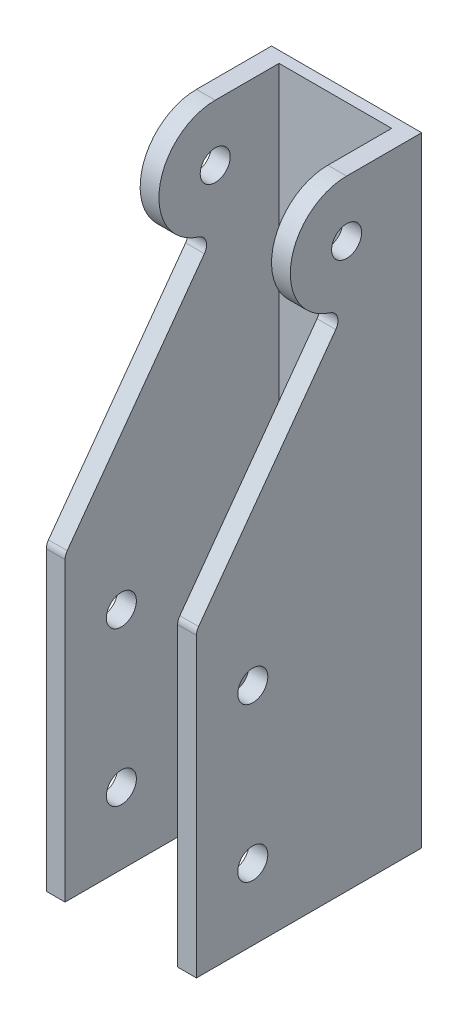
ISO-10303-21;
HEADER;
FILE_DESCRIPTION(('STEP AP214'),'2;1');
FILE_NAME('part.step','',(''),(''),'','','');
FILE_SCHEMA(('AUTOMOTIVE_DESIGN { 1 0 10303 214 1 1 1 1 }'));
ENDSEC;
DATA;
#1=APPLICATION_CONTEXT('core data for automotive mechanical design processes');
#2=APPLICATION_PROTOCOL_DEFINITION('international standard','automotive_design',2000,#1);
#3=PRODUCT_CONTEXT('',#1,'mechanical');
#4=PRODUCT('Part','Part','',(#3));
#5=PRODUCT_RELATED_PRODUCT_CATEGORY('part','',(#4));
#6=PRODUCT_DEFINITION_FORMATION('','',#4);
#7=PRODUCT_DEFINITION_CONTEXT('part definition',#1,'design');
#8=PRODUCT_DEFINITION('design','',#6,#7);
#9=PRODUCT_DEFINITION_SHAPE('','',#8);
#10=(LENGTH_UNIT() NAMED_UNIT(*) SI_UNIT(.MILLI.,.METRE.));
#11=(NAMED_UNIT(*) PLANE_ANGLE_UNIT() SI_UNIT($,.RADIAN.));
#12=(NAMED_UNIT(*) SI_UNIT($,.STERADIAN.) SOLID_ANGLE_UNIT());
#13=UNCERTAINTY_MEASURE_WITH_UNIT(LENGTH_MEASURE(1.E-05),#10,'distance_accuracy_value','');
#14=(GEOMETRIC_REPRESENTATION_CONTEXT(3) GLOBAL_UNCERTAINTY_ASSIGNED_CONTEXT((#13)) GLOBAL_UNIT_ASSIGNED_CONTEXT((#10,
#11,#12)) REPRESENTATION_CONTEXT('',''));
#15=CARTESIAN_POINT('',(0.,0.,0.));
#16=DIRECTION('',(0.,0.,1.));
#17=DIRECTION('',(1.,0.,0.));
#18=AXIS2_PLACEMENT_3D('',#15,#16,#17);
#19=CARTESIAN_POINT('',(20.,-100.,3.));
#20=DIRECTION('',(-1.,0.,0.));
#21=DIRECTION('',(0.,0.,1.));
#22=AXIS2_PLACEMENT_3D('',#19,#20,#21);
#23=PLANE('',#22);
#24=CARTESIAN_POINT('',(20.,-46.,45.));
#25=DIRECTION('',(-1.,0.,0.));
#26=DIRECTION('',(0.,0.,1.));
#27=AXIS2_PLACEMENT_3D('',#24,#25,#26);
#28=CIRCLE('',#27,4.);
#29=CARTESIAN_POINT('',(20.,-46.,49.));
#30=VERTEX_POINT('',#29);
#31=EDGE_CURVE('E312',#30,#30,#28,.T.);
#32=ORIENTED_EDGE('',*,*,#31,.T.);
#33=EDGE_LOOP('',(#32));
#34=FACE_BOUND('',#33,.T.);
#35=CARTESIAN_POINT('',(20.,-5.,45.));
#36=DIRECTION('',(-1.,0.,0.));
#37=DIRECTION('',(0.,0.,1.));
#38=AXIS2_PLACEMENT_3D('',#35,#36,#37);
#39=CIRCLE('',#38,4.);
#40=CARTESIAN_POINT('',(20.,-5.,49.));
#41=VERTEX_POINT('',#40);
#42=EDGE_CURVE('E305',#41,#41,#39,.T.);
#43=ORIENTED_EDGE('',*,*,#42,.T.);
#44=EDGE_LOOP('',(#43));
#45=FACE_BOUND('',#44,.T.);
#46=CARTESIAN_POINT('',(20.,85.,20.));
#47=DIRECTION('',(-1.,0.,0.));
#48=DIRECTION('',(0.,0.,1.));
#49=AXIS2_PLACEMENT_3D('',#46,#47,#48);
#50=CIRCLE('',#49,4.00000000000001);
#51=CARTESIAN_POINT('',(20.,85.,24.));
#52=VERTEX_POINT('',#51);
#53=EDGE_CURVE('E298',#52,#52,#50,.T.);
#54=ORIENTED_EDGE('',*,*,#53,.T.);
#55=EDGE_LOOP('',(#54));
#56=FACE_BOUND('',#55,.T.);
#57=DIRECTION('',(0.,-0.808736084303189,0.588171697675046));
#58=VECTOR('',#57,1.);
#59=CARTESIAN_POINT('',(20.,-33.1027027027027,94.9837837837838));
#60=LINE('',#59,#58);
#61=CARTESIAN_POINT('',(20.,66.0362138609409,22.8827535556794));
#62=VERTEX_POINT('',#61);
#63=CARTESIAN_POINT('',(20.,15.7889636522494,59.4262082529095));
#64=VERTEX_POINT('',#63);
#65=EDGE_CURVE('E273',#62,#64,#60,.T.);
#66=ORIENTED_EDGE('',*,*,#65,.T.);
#67=CARTESIAN_POINT('',(20.,14.0244485592242,57.));
#68=DIRECTION('',(-1.,0.,0.));
#69=DIRECTION('',(0.,0.,1.));
#70=AXIS2_PLACEMENT_3D('',#67,#68,#69);
#71=CIRCLE('',#70,3.);
#72=CARTESIAN_POINT('',(20.,14.0244485592242,60.));
#73=VERTEX_POINT('',#72);
#74=EDGE_CURVE('E364',#64,#73,#71,.F.);
#75=ORIENTED_EDGE('',*,*,#74,.T.);
#76=DIRECTION('',(0.,-1.,0.));
#77=VECTOR('',#76,1.);
#78=CARTESIAN_POINT('',(20.,-100.,60.));
#79=LINE('',#78,#77);
#80=CARTESIAN_POINT('',(20.,-65.,60.));
#81=VERTEX_POINT('',#80);
#82=EDGE_CURVE('E279',#73,#81,#79,.T.);
#83=ORIENTED_EDGE('',*,*,#82,.T.);
#84=DIRECTION('',(0.,0.,-1.));
#85=VECTOR('',#84,1.);
#86=CARTESIAN_POINT('',(20.,-65.,3.));
#87=LINE('',#86,#85);
#88=CARTESIAN_POINT('',(20.,-65.,0.));
#89=VERTEX_POINT('',#88);
#90=EDGE_CURVE('E286',#81,#89,#87,.T.);
#91=ORIENTED_EDGE('',*,*,#90,.T.);
#92=DIRECTION('',(0.,1.,0.));
#93=VECTOR('',#92,1.);
#94=CARTESIAN_POINT('',(20.,-100.,0.));
#95=LINE('',#94,#93);
#96=CARTESIAN_POINT('',(20.,100.,0.));
#97=VERTEX_POINT('',#96);
#98=EDGE_CURVE('E322',#89,#97,#95,.T.);
#99=ORIENTED_EDGE('',*,*,#98,.T.);
#100=DIRECTION('',(0.,0.,-1.));
#101=VECTOR('',#100,1.);
#102=CARTESIAN_POINT('',(20.,100.,3.));
#103=LINE('',#102,#101);
#104=CARTESIAN_POINT('',(20.,100.,20.));
#105=VERTEX_POINT('',#104);
#106=EDGE_CURVE('E337',#105,#97,#103,.T.);
#107=ORIENTED_EDGE('',*,*,#106,.F.);
#108=CARTESIAN_POINT('',(20.,85.,20.));
#109=DIRECTION('',(-1.,0.,0.));
#110=DIRECTION('',(0.,0.,1.));
#111=AXIS2_PLACEMENT_3D('',#108,#109,#110);
#112=CIRCLE('',#111,15.);
#113=CARTESIAN_POINT('',(20.,70.667274128305,24.4241348404908));
#114=VERTEX_POINT('',#113);
#115=EDGE_CURVE('E292',#114,#105,#112,.T.);
#116=ORIENTED_EDGE('',*,*,#115,.F.);
#117=CARTESIAN_POINT('',(20.,67.800728953966,25.308961808589));
#118=DIRECTION('',(-1.,0.,0.));
#119=DIRECTION('',(0.,0.,1.));
#120=AXIS2_PLACEMENT_3D('',#117,#118,#119);
#121=CIRCLE('',#120,3.);
#122=EDGE_CURVE('E378',#114,#62,#121,.T.);
#123=ORIENTED_EDGE('',*,*,#122,.T.);
#124=EDGE_LOOP('',(#66,#75,#83,#91,#99,#107,#116,#123));
#125=FACE_BOUND('',#124,.T.);
#126=ADVANCED_FACE('F120',(#34,#45,#56,#125),#23,.F.);
#127=CARTESIAN_POINT('',(-20.,100.,3.));
#128=DIRECTION('',(0.,-1.,0.));
#129=DIRECTION('',(0.,0.,-1.));
#130=AXIS2_PLACEMENT_3D('',#127,#128,#129);
#131=PLANE('',#130);
#132=DIRECTION('',(-1.,0.,0.));
#133=VECTOR('',#132,1.);
#134=CARTESIAN_POINT('',(40.,100.,20.));
#135=LINE('',#134,#133);
#136=CARTESIAN_POINT('',(15.,100.,20.));
#137=VERTEX_POINT('',#136);
#138=EDGE_CURVE('E267',#105,#137,#135,.T.);
#139=ORIENTED_EDGE('',*,*,#138,.F.);
#140=ORIENTED_EDGE('',*,*,#106,.T.);
#141=DIRECTION('',(-1.,0.,0.));
#142=VECTOR('',#141,1.);
#143=CARTESIAN_POINT('',(-20.,100.,0.));
#144=LINE('',#143,#142);
#145=CARTESIAN_POINT('',(-20.,100.,0.));
#146=VERTEX_POINT('',#145);
#147=EDGE_CURVE('E332',#97,#146,#144,.T.);
#148=ORIENTED_EDGE('',*,*,#147,.T.);
#149=DIRECTION('',(0.,0.,-1.));
#150=VECTOR('',#149,1.);
#151=CARTESIAN_POINT('',(-20.,100.,3.));
#152=LINE('',#151,#150);
#153=CARTESIAN_POINT('',(-20.,100.,20.));
#154=VERTEX_POINT('',#153);
#155=EDGE_CURVE('E329',#154,#146,#152,.T.);
#156=ORIENTED_EDGE('',*,*,#155,.F.);
#157=CARTESIAN_POINT('',(-15.,100.,20.));
#158=VERTEX_POINT('',#157);
#159=EDGE_CURVE('E264',#158,#154,#135,.T.);
#160=ORIENTED_EDGE('',*,*,#159,.F.);
#161=DIRECTION('',(0.,0.,-1.));
#162=VECTOR('',#161,1.);
#163=CARTESIAN_POINT('',(-15.,100.,63.));
#164=LINE('',#163,#162);
#165=CARTESIAN_POINT('',(-15.,100.,3.));
#166=VERTEX_POINT('',#165);
#167=EDGE_CURVE('E319',#158,#166,#164,.T.);
#168=ORIENTED_EDGE('',*,*,#167,.T.);
#169=DIRECTION('',(-1.,0.,0.));
#170=VECTOR('',#169,1.);
#171=CARTESIAN_POINT('',(-20.,100.,3.));
#172=LINE('',#171,#170);
#173=CARTESIAN_POINT('',(15.,100.,3.));
#174=VERTEX_POINT('',#173);
#175=EDGE_CURVE('E326',#174,#166,#172,.T.);
#176=ORIENTED_EDGE('',*,*,#175,.F.);
#177=DIRECTION('',(0.,0.,-1.));
#178=VECTOR('',#177,1.);
#179=CARTESIAN_POINT('',(15.,100.,63.));
#180=LINE('',#179,#178);
#181=EDGE_CURVE('E315',#137,#174,#180,.T.);
#182=ORIENTED_EDGE('',*,*,#181,.F.);
#183=EDGE_LOOP('',(#139,#140,#148,#156,#160,#168,#176,#182));
#184=FACE_BOUND('',#183,.T.);
#185=ADVANCED_FACE('F405',(#184),#131,.F.);
#186=CARTESIAN_POINT('',(-20.,-100.,3.));
#187=DIRECTION('',(1.,0.,0.));
#188=DIRECTION('',(0.,0.,-1.));
#189=AXIS2_PLACEMENT_3D('',#186,#187,#188);
#190=PLANE('',#189);
#191=CARTESIAN_POINT('',(-20.,-46.,45.));
#192=DIRECTION('',(-1.,0.,0.));
#193=DIRECTION('',(0.,0.,1.));
#194=AXIS2_PLACEMENT_3D('',#191,#192,#193);
#195=CIRCLE('',#194,4.);
#196=CARTESIAN_POINT('',(-20.,-46.,49.));
#197=VERTEX_POINT('',#196);
#198=EDGE_CURVE('E673',#197,#197,#195,.T.);
#199=ORIENTED_EDGE('',*,*,#198,.F.);
#200=EDGE_LOOP('',(#199));
#201=FACE_BOUND('',#200,.T.);
#202=CARTESIAN_POINT('',(-20.,-5.,45.));
#203=DIRECTION('',(-1.,0.,0.));
#204=DIRECTION('',(0.,0.,1.));
#205=AXIS2_PLACEMENT_3D('',#202,#203,#204);
#206=CIRCLE('',#205,4.);
#207=CARTESIAN_POINT('',(-20.,-5.,49.));
#208=VERTEX_POINT('',#207);
#209=EDGE_CURVE('E677',#208,#208,#206,.T.);
#210=ORIENTED_EDGE('',*,*,#209,.F.);
#211=EDGE_LOOP('',(#210));
#212=FACE_BOUND('',#211,.T.);
#213=CARTESIAN_POINT('',(-20.,85.,20.));
#214=DIRECTION('',(-1.,0.,0.));
#215=DIRECTION('',(0.,0.,1.));
#216=AXIS2_PLACEMENT_3D('',#213,#214,#215);
#217=CIRCLE('',#216,4.00000000000001);
#218=CARTESIAN_POINT('',(-20.,85.,24.));
#219=VERTEX_POINT('',#218);
#220=EDGE_CURVE('E386',#219,#219,#217,.T.);
#221=ORIENTED_EDGE('',*,*,#220,.F.);
#222=EDGE_LOOP('',(#221));
#223=FACE_BOUND('',#222,.T.);
#224=DIRECTION('',(0.,-1.,0.));
#225=VECTOR('',#224,1.);
#226=CARTESIAN_POINT('',(-20.,0.,60.));
#227=LINE('',#226,#225);
#228=CARTESIAN_POINT('',(-20.,14.0244485592242,60.));
#229=VERTEX_POINT('',#228);
#230=CARTESIAN_POINT('',(-20.,-65.,60.));
#231=VERTEX_POINT('',#230);
#232=EDGE_CURVE('E236',#229,#231,#227,.T.);
#233=ORIENTED_EDGE('',*,*,#232,.F.);
#234=CARTESIAN_POINT('',(-20.,14.0244485592242,57.));
#235=DIRECTION('',(1.,0.,0.));
#236=DIRECTION('',(0.,0.,-1.));
#237=AXIS2_PLACEMENT_3D('',#234,#235,#236);
#238=CIRCLE('',#237,3.);
#239=CARTESIAN_POINT('',(-20.,15.7889636522493,59.4262082529096));
#240=VERTEX_POINT('',#239);
#241=EDGE_CURVE('E367',#229,#240,#238,.F.);
#242=ORIENTED_EDGE('',*,*,#241,.T.);
#243=DIRECTION('',(0.,-0.808736084303189,0.588171697675046));
#244=VECTOR('',#243,1.);
#245=CARTESIAN_POINT('',(-20.,33.7297297297297,46.3783783783784));
#246=LINE('',#245,#244);
#247=CARTESIAN_POINT('',(-20.,66.0362138609409,22.8827535556794));
#248=VERTEX_POINT('',#247);
#249=EDGE_CURVE('E246',#248,#240,#246,.T.);
#250=ORIENTED_EDGE('',*,*,#249,.F.);
#251=CARTESIAN_POINT('',(-20.,67.800728953966,25.308961808589));
#252=DIRECTION('',(1.,0.,0.));
#253=DIRECTION('',(0.,0.,-1.));
#254=AXIS2_PLACEMENT_3D('',#251,#252,#253);
#255=CIRCLE('',#254,3.);
#256=CARTESIAN_POINT('',(-20.,70.667274128305,24.4241348404908));
#257=VERTEX_POINT('',#256);
#258=EDGE_CURVE('E128',#248,#257,#255,.T.);
#259=ORIENTED_EDGE('',*,*,#258,.T.);
#260=CARTESIAN_POINT('',(-20.,85.,20.));
#261=DIRECTION('',(-1.,0.,0.));
#262=DIRECTION('',(0.,0.,1.));
#263=AXIS2_PLACEMENT_3D('',#260,#261,#262);
#264=CIRCLE('',#263,15.);
#265=EDGE_CURVE('E380',#257,#154,#264,.T.);
#266=ORIENTED_EDGE('',*,*,#265,.T.);
#267=ORIENTED_EDGE('',*,*,#155,.T.);
#268=DIRECTION('',(0.,-1.,0.));
#269=VECTOR('',#268,1.);
#270=CARTESIAN_POINT('',(-20.,-100.,0.));
#271=LINE('',#270,#269);
#272=CARTESIAN_POINT('',(-20.,-65.,0.));
#273=VERTEX_POINT('',#272);
#274=EDGE_CURVE('E260',#146,#273,#271,.T.);
#275=ORIENTED_EDGE('',*,*,#274,.T.);
#276=DIRECTION('',(0.,0.,-1.));
#277=VECTOR('',#276,1.);
#278=CARTESIAN_POINT('',(-20.,-65.,0.));
#279=LINE('',#278,#277);
#280=EDGE_CURVE('E245',#231,#273,#279,.T.);
#281=ORIENTED_EDGE('',*,*,#280,.F.);
#282=EDGE_LOOP('',(#233,#242,#250,#259,#266,#267,#275,#281));
#283=FACE_BOUND('',#282,.T.);
#284=ADVANCED_FACE('F258',(#201,#212,#223,#283),#190,.F.);
#285=CARTESIAN_POINT('',(15.,100.,63.));
#286=DIRECTION('',(1.,0.,0.));
#287=DIRECTION('',(0.,1.,0.));
#288=AXIS2_PLACEMENT_3D('',#285,#286,#287);
#289=PLANE('',#288);
#290=CARTESIAN_POINT('',(15.,-46.,45.));
#291=DIRECTION('',(1.,0.,0.));
#292=DIRECTION('',(0.,1.,0.));
#293=AXIS2_PLACEMENT_3D('',#290,#291,#292);
#294=CIRCLE('',#293,4.);
#295=CARTESIAN_POINT('',(15.,-42.,45.));
#296=VERTEX_POINT('',#295);
#297=EDGE_CURVE('E309',#296,#296,#294,.T.);
#298=ORIENTED_EDGE('',*,*,#297,.T.);
#299=EDGE_LOOP('',(#298));
#300=FACE_BOUND('',#299,.T.);
#301=CARTESIAN_POINT('',(15.,-5.,45.));
#302=DIRECTION('',(1.,0.,0.));
#303=DIRECTION('',(0.,1.,0.));
#304=AXIS2_PLACEMENT_3D('',#301,#302,#303);
#305=CIRCLE('',#304,4.);
#306=CARTESIAN_POINT('',(15.,-0.999999999999999,45.));
#307=VERTEX_POINT('',#306);
#308=EDGE_CURVE('E302',#307,#307,#305,.T.);
#309=ORIENTED_EDGE('',*,*,#308,.T.);
#310=EDGE_LOOP('',(#309));
#311=FACE_BOUND('',#310,.T.);
#312=CARTESIAN_POINT('',(15.,85.,20.));
#313=DIRECTION('',(1.,0.,0.));
#314=DIRECTION('',(0.,1.,0.));
#315=AXIS2_PLACEMENT_3D('',#312,#313,#314);
#316=CIRCLE('',#315,4.00000000000001);
#317=CARTESIAN_POINT('',(15.,89.,20.));
#318=VERTEX_POINT('',#317);
#319=EDGE_CURVE('E295',#318,#318,#316,.T.);
#320=ORIENTED_EDGE('',*,*,#319,.T.);
#321=EDGE_LOOP('',(#320));
#322=FACE_BOUND('',#321,.T.);
#323=DIRECTION('',(0.,1.,0.));
#324=VECTOR('',#323,1.);
#325=CARTESIAN_POINT('',(15.,100.,60.));
#326=LINE('',#325,#324);
#327=CARTESIAN_POINT('',(15.,-65.,60.));
#328=VERTEX_POINT('',#327);
#329=CARTESIAN_POINT('',(15.,14.0244485592242,60.));
#330=VERTEX_POINT('',#329);
#331=EDGE_CURVE('E276',#328,#330,#326,.T.);
#332=ORIENTED_EDGE('',*,*,#331,.T.);
#333=CARTESIAN_POINT('',(15.,14.0244485592242,57.));
#334=DIRECTION('',(1.,0.,0.));
#335=DIRECTION('',(0.,1.,0.));
#336=AXIS2_PLACEMENT_3D('',#333,#334,#335);
#337=CIRCLE('',#336,3.);
#338=CARTESIAN_POINT('',(15.,15.7889636522493,59.4262082529096));
#339=VERTEX_POINT('',#338);
#340=EDGE_CURVE('E362',#330,#339,#337,.F.);
#341=ORIENTED_EDGE('',*,*,#340,.T.);
#342=DIRECTION('',(0.,0.808736084303189,-0.588171697675046));
#343=VECTOR('',#342,1.);
#344=CARTESIAN_POINT('',(15.,69.1675675675676,20.6054054054054));
#345=LINE('',#344,#343);
#346=CARTESIAN_POINT('',(15.,66.0362138609409,22.8827535556794));
#347=VERTEX_POINT('',#346);
#348=EDGE_CURVE('E270',#339,#347,#345,.T.);
#349=ORIENTED_EDGE('',*,*,#348,.T.);
#350=CARTESIAN_POINT('',(15.,67.800728953966,25.308961808589));
#351=DIRECTION('',(1.,0.,0.));
#352=DIRECTION('',(0.,1.,0.));
#353=AXIS2_PLACEMENT_3D('',#350,#351,#352);
#354=CIRCLE('',#353,3.);
#355=CARTESIAN_POINT('',(15.,70.667274128305,24.4241348404908));
#356=VERTEX_POINT('',#355);
#357=EDGE_CURVE('E376',#347,#356,#354,.T.);
#358=ORIENTED_EDGE('',*,*,#357,.T.);
#359=CARTESIAN_POINT('',(15.,85.,20.));
#360=DIRECTION('',(1.,0.,0.));
#361=DIRECTION('',(0.,1.,0.));
#362=AXIS2_PLACEMENT_3D('',#359,#360,#361);
#363=CIRCLE('',#362,15.);
#364=EDGE_CURVE('E289',#137,#356,#363,.T.);
#365=ORIENTED_EDGE('',*,*,#364,.F.);
#366=ORIENTED_EDGE('',*,*,#181,.T.);
#367=DIRECTION('',(0.,-1.,0.));
#368=VECTOR('',#367,1.);
#369=CARTESIAN_POINT('',(15.,100.,3.));
#370=LINE('',#369,#368);
#371=CARTESIAN_POINT('',(15.,-65.,3.));
#372=VERTEX_POINT('',#371);
#373=EDGE_CURVE('E320',#174,#372,#370,.T.);
#374=ORIENTED_EDGE('',*,*,#373,.T.);
#375=DIRECTION('',(0.,0.,1.));
#376=VECTOR('',#375,1.);
#377=CARTESIAN_POINT('',(15.,-65.,63.));
#378=LINE('',#377,#376);
#379=EDGE_CURVE('E283',#372,#328,#378,.T.);
#380=ORIENTED_EDGE('',*,*,#379,.T.);
#381=EDGE_LOOP('',(#332,#341,#349,#358,#365,#366,#374,#380));
#382=FACE_BOUND('',#381,.T.);
#383=ADVANCED_FACE('F424',(#300,#311,#322,#382),#289,.F.);
#384=CARTESIAN_POINT('',(-15.,100.,63.));
#385=DIRECTION('',(-1.,0.,0.));
#386=DIRECTION('',(0.,-1.,0.));
#387=AXIS2_PLACEMENT_3D('',#384,#385,#386);
#388=PLANE('',#387);
#389=CARTESIAN_POINT('',(-15.,-46.,45.));
#390=DIRECTION('',(-1.,0.,0.));
#391=DIRECTION('',(0.,-1.,0.));
#392=AXIS2_PLACEMENT_3D('',#389,#390,#391);
#393=CIRCLE('',#392,4.);
#394=CARTESIAN_POINT('',(-15.,-50.,45.));
#395=VERTEX_POINT('',#394);
#396=EDGE_CURVE('E308',#395,#395,#393,.T.);
#397=ORIENTED_EDGE('',*,*,#396,.T.);
#398=EDGE_LOOP('',(#397));
#399=FACE_BOUND('',#398,.T.);
#400=CARTESIAN_POINT('',(-15.,-5.,45.));
#401=DIRECTION('',(-1.,0.,0.));
#402=DIRECTION('',(0.,-1.,0.));
#403=AXIS2_PLACEMENT_3D('',#400,#401,#402);
#404=CIRCLE('',#403,4.);
#405=CARTESIAN_POINT('',(-15.,-9.,45.));
#406=VERTEX_POINT('',#405);
#407=EDGE_CURVE('E301',#406,#406,#404,.T.);
#408=ORIENTED_EDGE('',*,*,#407,.T.);
#409=EDGE_LOOP('',(#408));
#410=FACE_BOUND('',#409,.T.);
#411=CARTESIAN_POINT('',(-15.,85.,20.));
#412=DIRECTION('',(-1.,0.,0.));
#413=DIRECTION('',(0.,-1.,0.));
#414=AXIS2_PLACEMENT_3D('',#411,#412,#413);
#415=CIRCLE('',#414,4.00000000000001);
#416=CARTESIAN_POINT('',(-15.,81.,20.));
#417=VERTEX_POINT('',#416);
#418=EDGE_CURVE('E294',#417,#417,#415,.T.);
#419=ORIENTED_EDGE('',*,*,#418,.T.);
#420=EDGE_LOOP('',(#419));
#421=FACE_BOUND('',#420,.T.);
#422=DIRECTION('',(0.,-0.808736084303189,0.588171697675046));
#423=VECTOR('',#422,1.);
#424=CARTESIAN_POINT('',(-15.,69.1675675675676,20.6054054054054));
#425=LINE('',#424,#423);
#426=CARTESIAN_POINT('',(-15.,66.0362138609409,22.8827535556794));
#427=VERTEX_POINT('',#426);
#428=CARTESIAN_POINT('',(-15.,15.7889636522493,59.4262082529096));
#429=VERTEX_POINT('',#428);
#430=EDGE_CURVE('E339',#427,#429,#425,.T.);
#431=ORIENTED_EDGE('',*,*,#430,.T.);
#432=CARTESIAN_POINT('',(-15.,14.0244485592242,57.));
#433=DIRECTION('',(-1.,0.,0.));
#434=DIRECTION('',(0.,-1.,0.));
#435=AXIS2_PLACEMENT_3D('',#432,#433,#434);
#436=CIRCLE('',#435,3.);
#437=CARTESIAN_POINT('',(-15.,14.0244485592242,60.));
#438=VERTEX_POINT('',#437);
#439=EDGE_CURVE('E373',#429,#438,#436,.F.);
#440=ORIENTED_EDGE('',*,*,#439,.T.);
#441=DIRECTION('',(0.,-1.,0.));
#442=VECTOR('',#441,1.);
#443=CARTESIAN_POINT('',(-15.,100.,60.));
#444=LINE('',#443,#442);
#445=CARTESIAN_POINT('',(-15.,-65.,60.));
#446=VERTEX_POINT('',#445);
#447=EDGE_CURVE('E341',#438,#446,#444,.T.);
#448=ORIENTED_EDGE('',*,*,#447,.T.);
#449=DIRECTION('',(0.,0.,-1.));
#450=VECTOR('',#449,1.);
#451=CARTESIAN_POINT('',(-15.,-65.,63.));
#452=LINE('',#451,#450);
#453=CARTESIAN_POINT('',(-15.,-65.,3.));
#454=VERTEX_POINT('',#453);
#455=EDGE_CURVE('E254',#446,#454,#452,.T.);
#456=ORIENTED_EDGE('',*,*,#455,.T.);
#457=DIRECTION('',(0.,1.,0.));
#458=VECTOR('',#457,1.);
#459=CARTESIAN_POINT('',(-15.,100.,3.));
#460=LINE('',#459,#458);
#461=EDGE_CURVE('E316',#454,#166,#460,.T.);
#462=ORIENTED_EDGE('',*,*,#461,.T.);
#463=ORIENTED_EDGE('',*,*,#167,.F.);
#464=CARTESIAN_POINT('',(-15.,85.,20.));
#465=DIRECTION('',(-1.,0.,0.));
#466=DIRECTION('',(0.,-1.,0.));
#467=AXIS2_PLACEMENT_3D('',#464,#465,#466);
#468=CIRCLE('',#467,15.);
#469=CARTESIAN_POINT('',(-15.,70.667274128305,24.4241348404908));
#470=VERTEX_POINT('',#469);
#471=EDGE_CURVE('E344',#470,#158,#468,.T.);
#472=ORIENTED_EDGE('',*,*,#471,.F.);
#473=CARTESIAN_POINT('',(-15.,67.800728953966,25.308961808589));
#474=DIRECTION('',(-1.,0.,0.));
#475=DIRECTION('',(0.,-1.,0.));
#476=AXIS2_PLACEMENT_3D('',#473,#474,#475);
#477=CIRCLE('',#476,3.);
#478=EDGE_CURVE('E12',#470,#427,#477,.T.);
#479=ORIENTED_EDGE('',*,*,#478,.T.);
#480=EDGE_LOOP('',(#431,#440,#448,#456,#462,#463,#472,#479));
#481=FACE_BOUND('',#480,.T.);
#482=ADVANCED_FACE('F390',(#399,#410,#421,#481),#388,.F.);
#483=CARTESIAN_POINT('',(0.,0.,3.));
#484=DIRECTION('',(0.,0.,1.));
#485=DIRECTION('',(1.,0.,0.));
#486=AXIS2_PLACEMENT_3D('',#483,#484,#485);
#487=PLANE('',#486);
#488=DIRECTION('',(-1.,0.,0.));
#489=VECTOR('',#488,1.);
#490=CARTESIAN_POINT('',(0.,-65.,3.));
#491=LINE('',#490,#489);
#492=EDGE_CURVE('E281',#372,#454,#491,.T.);
#493=ORIENTED_EDGE('',*,*,#492,.F.);
#494=ORIENTED_EDGE('',*,*,#373,.F.);
#495=ORIENTED_EDGE('',*,*,#175,.T.);
#496=ORIENTED_EDGE('',*,*,#461,.F.);
#497=EDGE_LOOP('',(#493,#494,#495,#496));
#498=FACE_BOUND('',#497,.T.);
#499=ADVANCED_FACE('F399',(#498),#487,.T.);
#500=CARTESIAN_POINT('',(0.,0.,0.));
#501=DIRECTION('',(0.,0.,1.));
#502=DIRECTION('',(1.,0.,0.));
#503=AXIS2_PLACEMENT_3D('',#500,#501,#502);
#504=PLANE('',#503);
#505=ORIENTED_EDGE('',*,*,#98,.F.);
#506=DIRECTION('',(-1.,0.,0.));
#507=VECTOR('',#506,1.);
#508=CARTESIAN_POINT('',(40.,-65.,0.));
#509=LINE('',#508,#507);
#510=EDGE_CURVE('E268',#89,#273,#509,.T.);
#511=ORIENTED_EDGE('',*,*,#510,.T.);
#512=ORIENTED_EDGE('',*,*,#274,.F.);
#513=ORIENTED_EDGE('',*,*,#147,.F.);
#514=EDGE_LOOP('',(#505,#511,#512,#513));
#515=FACE_BOUND('',#514,.T.);
#516=ADVANCED_FACE('F410',(#515),#504,.F.);
#517=CARTESIAN_POINT('',(40.,85.,20.));
#518=DIRECTION('',(-1.,0.,0.));
#519=DIRECTION('',(0.,0.,1.));
#520=AXIS2_PLACEMENT_3D('',#517,#518,#519);
#521=CYLINDRICAL_SURFACE('',#520,15.);
#522=ORIENTED_EDGE('',*,*,#364,.T.);
#523=DIRECTION('',(-1.,0.,0.));
#524=VECTOR('',#523,1.);
#525=CARTESIAN_POINT('',(40.,70.667274128305,24.4241348404908));
#526=LINE('',#525,#524);
#527=EDGE_CURVE('E357',#356,#114,#526,.F.);
#528=ORIENTED_EDGE('',*,*,#527,.T.);
#529=ORIENTED_EDGE('',*,*,#115,.T.);
#530=ORIENTED_EDGE('',*,*,#138,.T.);
#531=EDGE_LOOP('',(#522,#528,#529,#530));
#532=FACE_BOUND('',#531,.T.);
#533=ADVANCED_FACE('F435',(#532),#521,.T.);
#534=ORIENTED_EDGE('',*,*,#265,.F.);
#535=DIRECTION('',(-1.,0.,0.));
#536=VECTOR('',#535,1.);
#537=CARTESIAN_POINT('',(40.,70.667274128305,24.4241348404908));
#538=LINE('',#537,#536);
#539=EDGE_CURVE('E135',#257,#470,#538,.F.);
#540=ORIENTED_EDGE('',*,*,#539,.T.);
#541=ORIENTED_EDGE('',*,*,#471,.T.);
#542=ORIENTED_EDGE('',*,*,#159,.T.);
#543=EDGE_LOOP('',(#534,#540,#541,#542));
#544=FACE_BOUND('',#543,.T.);
#545=ADVANCED_FACE('F383',(#544),#521,.T.);
#546=CARTESIAN_POINT('',(40.,-65.,0.));
#547=DIRECTION('',(0.,1.,0.));
#548=DIRECTION('',(0.,0.,1.));
#549=AXIS2_PLACEMENT_3D('',#546,#547,#548);
#550=PLANE('',#549);
#551=DIRECTION('',(-1.,0.,0.));
#552=VECTOR('',#551,1.);
#553=CARTESIAN_POINT('',(40.,-65.,60.));
#554=LINE('',#553,#552);
#555=EDGE_CURVE('E255',#81,#328,#554,.T.);
#556=ORIENTED_EDGE('',*,*,#555,.T.);
#557=ORIENTED_EDGE('',*,*,#379,.F.);
#558=ORIENTED_EDGE('',*,*,#492,.T.);
#559=ORIENTED_EDGE('',*,*,#455,.F.);
#560=EDGE_CURVE('E240',#446,#231,#554,.T.);
#561=ORIENTED_EDGE('',*,*,#560,.T.);
#562=ORIENTED_EDGE('',*,*,#280,.T.);
#563=ORIENTED_EDGE('',*,*,#510,.F.);
#564=ORIENTED_EDGE('',*,*,#90,.F.);
#565=EDGE_LOOP('',(#556,#557,#558,#559,#561,#562,#563,#564));
#566=FACE_BOUND('',#565,.T.);
#567=ADVANCED_FACE('F251',(#566),#550,.F.);
#568=CARTESIAN_POINT('',(40.,0.,60.));
#569=DIRECTION('',(0.,0.,-1.));
#570=DIRECTION('',(-1.,0.,0.));
#571=AXIS2_PLACEMENT_3D('',#568,#569,#570);
#572=PLANE('',#571);
#573=ORIENTED_EDGE('',*,*,#82,.F.);
#574=DIRECTION('',(-1.,0.,0.));
#575=VECTOR('',#574,1.);
#576=CARTESIAN_POINT('',(40.,14.0244485592242,60.));
#577=LINE('',#576,#575);
#578=EDGE_CURVE('E359',#73,#330,#577,.T.);
#579=ORIENTED_EDGE('',*,*,#578,.T.);
#580=ORIENTED_EDGE('',*,*,#331,.F.);
#581=ORIENTED_EDGE('',*,*,#555,.F.);
#582=EDGE_LOOP('',(#573,#579,#580,#581));
#583=FACE_BOUND('',#582,.T.);
#584=ADVANCED_FACE('F418',(#583),#572,.F.);
#585=ORIENTED_EDGE('',*,*,#447,.F.);
#586=DIRECTION('',(-1.,0.,0.));
#587=VECTOR('',#586,1.);
#588=CARTESIAN_POINT('',(40.,14.0244485592242,60.));
#589=LINE('',#588,#587);
#590=EDGE_CURVE('E242',#438,#229,#589,.T.);
#591=ORIENTED_EDGE('',*,*,#590,.T.);
#592=ORIENTED_EDGE('',*,*,#232,.T.);
#593=ORIENTED_EDGE('',*,*,#560,.F.);
#594=EDGE_LOOP('',(#585,#591,#592,#593));
#595=FACE_BOUND('',#594,.T.);
#596=ADVANCED_FACE('F239',(#595),#572,.F.);
#597=CARTESIAN_POINT('',(40.,33.7297297297297,46.3783783783784));
#598=DIRECTION('',(0.,-0.588171697675046,-0.808736084303189));
#599=DIRECTION('',(0.,0.808736084303189,-0.588171697675046));
#600=AXIS2_PLACEMENT_3D('',#597,#598,#599);
#601=PLANE('',#600);
#602=ORIENTED_EDGE('',*,*,#65,.F.);
#603=DIRECTION('',(-1.,0.,0.));
#604=VECTOR('',#603,1.);
#605=CARTESIAN_POINT('',(40.,66.0362138609409,22.8827535556794));
#606=LINE('',#605,#604);
#607=EDGE_CURVE('E354',#62,#347,#606,.T.);
#608=ORIENTED_EDGE('',*,*,#607,.T.);
#609=ORIENTED_EDGE('',*,*,#348,.F.);
#610=DIRECTION('',(-1.,0.,0.));
#611=VECTOR('',#610,1.);
#612=CARTESIAN_POINT('',(40.,15.7889636522493,59.4262082529096));
#613=LINE('',#612,#611);
#614=EDGE_CURVE('E346',#339,#64,#613,.F.);
#615=ORIENTED_EDGE('',*,*,#614,.T.);
#616=EDGE_LOOP('',(#602,#608,#609,#615));
#617=FACE_BOUND('',#616,.T.);
#618=ADVANCED_FACE('F427',(#617),#601,.F.);
#619=ORIENTED_EDGE('',*,*,#249,.T.);
#620=DIRECTION('',(-1.,0.,0.));
#621=VECTOR('',#620,1.);
#622=CARTESIAN_POINT('',(40.,15.7889636522493,59.4262082529096));
#623=LINE('',#622,#621);
#624=EDGE_CURVE('E143',#240,#429,#623,.F.);
#625=ORIENTED_EDGE('',*,*,#624,.T.);
#626=ORIENTED_EDGE('',*,*,#430,.F.);
#627=DIRECTION('',(-1.,0.,0.));
#628=VECTOR('',#627,1.);
#629=CARTESIAN_POINT('',(40.,66.0362138609409,22.8827535556794));
#630=LINE('',#629,#628);
#631=EDGE_CURVE('E369',#427,#248,#630,.T.);
#632=ORIENTED_EDGE('',*,*,#631,.T.);
#633=EDGE_LOOP('',(#619,#625,#626,#632));
#634=FACE_BOUND('',#633,.T.);
#635=ADVANCED_FACE('F393',(#634),#601,.F.);
#636=CARTESIAN_POINT('',(40.,85.,20.));
#637=DIRECTION('',(-1.,0.,0.));
#638=DIRECTION('',(0.,0.,1.));
#639=AXIS2_PLACEMENT_3D('',#636,#637,#638);
#640=CYLINDRICAL_SURFACE('',#639,4.00000000000001);
#641=ORIENTED_EDGE('',*,*,#220,.T.);
#642=EDGE_LOOP('',(#641));
#643=FACE_BOUND('',#642,.T.);
#644=ORIENTED_EDGE('',*,*,#418,.F.);
#645=EDGE_LOOP('',(#644));
#646=FACE_BOUND('',#645,.T.);
#647=ADVANCED_FACE('F519',(#643,#646),#640,.F.);
#648=CARTESIAN_POINT('',(40.,-5.,45.));
#649=DIRECTION('',(-1.,0.,0.));
#650=DIRECTION('',(0.,0.,1.));
#651=AXIS2_PLACEMENT_3D('',#648,#649,#650);
#652=CYLINDRICAL_SURFACE('',#651,4.);
#653=ORIENTED_EDGE('',*,*,#209,.T.);
#654=EDGE_LOOP('',(#653));
#655=FACE_BOUND('',#654,.T.);
#656=ORIENTED_EDGE('',*,*,#407,.F.);
#657=EDGE_LOOP('',(#656));
#658=FACE_BOUND('',#657,.T.);
#659=ADVANCED_FACE('F509',(#655,#658),#652,.F.);
#660=CARTESIAN_POINT('',(40.,-46.,45.));
#661=DIRECTION('',(-1.,0.,0.));
#662=DIRECTION('',(0.,0.,1.));
#663=AXIS2_PLACEMENT_3D('',#660,#661,#662);
#664=CYLINDRICAL_SURFACE('',#663,4.);
#665=ORIENTED_EDGE('',*,*,#198,.T.);
#666=EDGE_LOOP('',(#665));
#667=FACE_BOUND('',#666,.T.);
#668=ORIENTED_EDGE('',*,*,#396,.F.);
#669=EDGE_LOOP('',(#668));
#670=FACE_BOUND('',#669,.T.);
#671=ADVANCED_FACE('F498',(#667,#670),#664,.F.);
#672=ORIENTED_EDGE('',*,*,#319,.F.);
#673=EDGE_LOOP('',(#672));
#674=FACE_BOUND('',#673,.T.);
#675=ORIENTED_EDGE('',*,*,#53,.F.);
#676=EDGE_LOOP('',(#675));
#677=FACE_BOUND('',#676,.T.);
#678=ADVANCED_FACE('F506',(#674,#677),#640,.F.);
#679=ORIENTED_EDGE('',*,*,#308,.F.);
#680=EDGE_LOOP('',(#679));
#681=FACE_BOUND('',#680,.T.);
#682=ORIENTED_EDGE('',*,*,#42,.F.);
#683=EDGE_LOOP('',(#682));
#684=FACE_BOUND('',#683,.T.);
#685=ADVANCED_FACE('F495',(#681,#684),#652,.F.);
#686=ORIENTED_EDGE('',*,*,#297,.F.);
#687=EDGE_LOOP('',(#686));
#688=FACE_BOUND('',#687,.T.);
#689=ORIENTED_EDGE('',*,*,#31,.F.);
#690=EDGE_LOOP('',(#689));
#691=FACE_BOUND('',#690,.T.);
#692=ADVANCED_FACE('F461',(#688,#691),#664,.F.);
#693=CARTESIAN_POINT('',(40.,67.800728953966,25.308961808589));
#694=DIRECTION('',(-1.,0.,0.));
#695=DIRECTION('',(0.,0.,1.));
#696=AXIS2_PLACEMENT_3D('',#693,#694,#695);
#697=CYLINDRICAL_SURFACE('',#696,3.);
#698=ORIENTED_EDGE('',*,*,#122,.F.);
#699=ORIENTED_EDGE('',*,*,#527,.F.);
#700=ORIENTED_EDGE('',*,*,#357,.F.);
#701=ORIENTED_EDGE('',*,*,#607,.F.);
#702=EDGE_LOOP('',(#698,#699,#700,#701));
#703=FACE_BOUND('',#702,.T.);
#704=ADVANCED_FACE('F431',(#703),#697,.F.);
#705=CARTESIAN_POINT('',(40.,14.0244485592242,57.));
#706=DIRECTION('',(-1.,0.,0.));
#707=DIRECTION('',(0.,0.,1.));
#708=AXIS2_PLACEMENT_3D('',#705,#706,#707);
#709=CYLINDRICAL_SURFACE('',#708,3.);
#710=ORIENTED_EDGE('',*,*,#74,.F.);
#711=ORIENTED_EDGE('',*,*,#614,.F.);
#712=ORIENTED_EDGE('',*,*,#340,.F.);
#713=ORIENTED_EDGE('',*,*,#578,.F.);
#714=EDGE_LOOP('',(#710,#711,#712,#713));
#715=FACE_BOUND('',#714,.T.);
#716=ADVANCED_FACE('F420',(#715),#709,.T.);
#717=CARTESIAN_POINT('',(40.,14.0244485592242,57.));
#718=DIRECTION('',(-1.,0.,0.));
#719=DIRECTION('',(0.,0.,1.));
#720=AXIS2_PLACEMENT_3D('',#717,#718,#719);
#721=CYLINDRICAL_SURFACE('',#720,3.);
#722=ORIENTED_EDGE('',*,*,#439,.F.);
#723=ORIENTED_EDGE('',*,*,#624,.F.);
#724=ORIENTED_EDGE('',*,*,#241,.F.);
#725=ORIENTED_EDGE('',*,*,#590,.F.);
#726=EDGE_LOOP('',(#722,#723,#724,#725));
#727=FACE_BOUND('',#726,.T.);
#728=ADVANCED_FACE('F395',(#727),#721,.T.);
#729=CARTESIAN_POINT('',(40.,67.800728953966,25.308961808589));
#730=DIRECTION('',(-1.,0.,0.));
#731=DIRECTION('',(0.,0.,1.));
#732=AXIS2_PLACEMENT_3D('',#729,#730,#731);
#733=CYLINDRICAL_SURFACE('',#732,3.);
#734=ORIENTED_EDGE('',*,*,#478,.F.);
#735=ORIENTED_EDGE('',*,*,#539,.F.);
#736=ORIENTED_EDGE('',*,*,#258,.F.);
#737=ORIENTED_EDGE('',*,*,#631,.F.);
#738=EDGE_LOOP('',(#734,#735,#736,#737));
#739=FACE_BOUND('',#738,.T.);
#740=ADVANCED_FACE('F122',(#739),#733,.F.);
#741=CLOSED_SHELL('',(#126,#185,#284,#383,#482,#499,#516,#533,#545,#567,#584,#596,#618,#635,
#647,#659,#671,#678,#685,#692,#704,#716,#728,#740));
#742=MANIFOLD_SOLID_BREP('B2',#741);
#743=ADVANCED_BREP_SHAPE_REPRESENTATION('',(#18,#742),#14);
#744=SHAPE_DEFINITION_REPRESENTATION(#9,#743);
ENDSEC;
END-ISO-10303-21;
